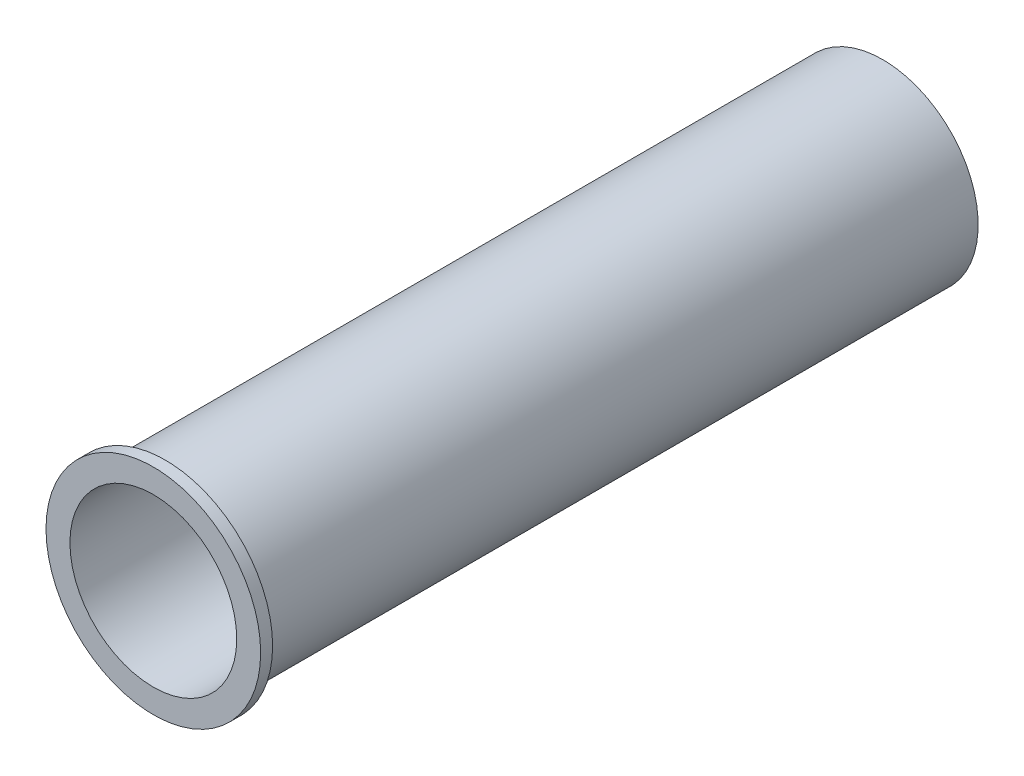
ISO-10303-21;
HEADER;
FILE_DESCRIPTION(('STEP AP214'),'2;1');
FILE_NAME('part.step','',(''),(''),'','','');
FILE_SCHEMA(('AUTOMOTIVE_DESIGN { 1 0 10303 214 1 1 1 1 }'));
ENDSEC;
DATA;
#1=APPLICATION_CONTEXT('core data for automotive mechanical design processes');
#2=APPLICATION_PROTOCOL_DEFINITION('international standard','automotive_design',2000,#1);
#3=PRODUCT_CONTEXT('',#1,'mechanical');
#4=PRODUCT('Part','Part','',(#3));
#5=PRODUCT_RELATED_PRODUCT_CATEGORY('part','',(#4));
#6=PRODUCT_DEFINITION_FORMATION('','',#4);
#7=PRODUCT_DEFINITION_CONTEXT('part definition',#1,'design');
#8=PRODUCT_DEFINITION('design','',#6,#7);
#9=PRODUCT_DEFINITION_SHAPE('','',#8);
#10=(LENGTH_UNIT() NAMED_UNIT(*) SI_UNIT(.MILLI.,.METRE.));
#11=(NAMED_UNIT(*) PLANE_ANGLE_UNIT() SI_UNIT($,.RADIAN.));
#12=(NAMED_UNIT(*) SI_UNIT($,.STERADIAN.) SOLID_ANGLE_UNIT());
#13=UNCERTAINTY_MEASURE_WITH_UNIT(LENGTH_MEASURE(1.E-05),#10,'distance_accuracy_value','');
#14=(GEOMETRIC_REPRESENTATION_CONTEXT(3) GLOBAL_UNCERTAINTY_ASSIGNED_CONTEXT((#13)) GLOBAL_UNIT_ASSIGNED_CONTEXT((#10,
#11,#12)) REPRESENTATION_CONTEXT('',''));
#15=CARTESIAN_POINT('',(0.,0.,0.));
#16=DIRECTION('',(0.,0.,1.));
#17=DIRECTION('',(1.,0.,0.));
#18=AXIS2_PLACEMENT_3D('',#15,#16,#17);
#19=CARTESIAN_POINT('',(0.,0.,0.));
#20=DIRECTION('',(0.,0.,-1.));
#21=DIRECTION('',(-1.,0.,0.));
#22=AXIS2_PLACEMENT_3D('',#19,#20,#21);
#23=CYLINDRICAL_SURFACE('',#22,17.95);
#24=CARTESIAN_POINT('',(0.,0.,60.));
#25=DIRECTION('',(0.,0.,-1.));
#26=DIRECTION('',(-1.,0.,0.));
#27=AXIS2_PLACEMENT_3D('',#24,#25,#26);
#28=CIRCLE('',#27,17.95);
#29=CARTESIAN_POINT('',(-17.95,0.,60.));
#30=VERTEX_POINT('',#29);
#31=EDGE_CURVE('E78',#30,#30,#28,.T.);
#32=ORIENTED_EDGE('',*,*,#31,.T.);
#33=EDGE_LOOP('',(#32));
#34=FACE_BOUND('',#33,.T.);
#35=CARTESIAN_POINT('',(0.,0.,58.));
#36=DIRECTION('',(0.,0.,-1.));
#37=DIRECTION('',(-1.,0.,0.));
#38=AXIS2_PLACEMENT_3D('',#35,#36,#37);
#39=CIRCLE('',#38,17.95);
#40=CARTESIAN_POINT('',(-17.95,0.,58.));
#41=VERTEX_POINT('',#40);
#42=EDGE_CURVE('E10',#41,#41,#39,.T.);
#43=ORIENTED_EDGE('',*,*,#42,.F.);
#44=EDGE_LOOP('',(#43));
#45=FACE_BOUND('',#44,.T.);
#46=ADVANCED_FACE('F43',(#34,#45),#23,.T.);
#47=CARTESIAN_POINT('',(0.,17.95,58.));
#48=DIRECTION('',(0.,0.,-1.));
#49=DIRECTION('',(-1.,0.,0.));
#50=AXIS2_PLACEMENT_3D('',#47,#48,#49);
#51=PLANE('',#50);
#52=ORIENTED_EDGE('',*,*,#42,.T.);
#53=EDGE_LOOP('',(#52));
#54=FACE_BOUND('',#53,.T.);
#55=CARTESIAN_POINT('',(0.,0.,58.));
#56=DIRECTION('',(0.,0.,-1.));
#57=DIRECTION('',(-1.,0.,0.));
#58=AXIS2_PLACEMENT_3D('',#55,#56,#57);
#59=CIRCLE('',#58,15.95);
#60=CARTESIAN_POINT('',(-15.95,0.,58.));
#61=VERTEX_POINT('',#60);
#62=EDGE_CURVE('E50',#61,#61,#59,.T.);
#63=ORIENTED_EDGE('',*,*,#62,.F.);
#64=EDGE_LOOP('',(#63));
#65=FACE_BOUND('',#64,.T.);
#66=ADVANCED_FACE('F97',(#54,#65),#51,.T.);
#67=CARTESIAN_POINT('',(0.,0.,0.));
#68=DIRECTION('',(0.,0.,-1.));
#69=DIRECTION('',(-1.,0.,0.));
#70=AXIS2_PLACEMENT_3D('',#67,#68,#69);
#71=CYLINDRICAL_SURFACE('',#70,15.95);
#72=ORIENTED_EDGE('',*,*,#62,.T.);
#73=EDGE_LOOP('',(#72));
#74=FACE_BOUND('',#73,.T.);
#75=CARTESIAN_POINT('',(0.,0.,-62.));
#76=DIRECTION('',(0.,0.,-1.));
#77=DIRECTION('',(-1.,0.,0.));
#78=AXIS2_PLACEMENT_3D('',#75,#76,#77);
#79=CIRCLE('',#78,15.95);
#80=CARTESIAN_POINT('',(-15.95,0.,-62.));
#81=VERTEX_POINT('',#80);
#82=EDGE_CURVE('E55',#81,#81,#79,.T.);
#83=ORIENTED_EDGE('',*,*,#82,.F.);
#84=EDGE_LOOP('',(#83));
#85=FACE_BOUND('',#84,.T.);
#86=ADVANCED_FACE('F101',(#74,#85),#71,.T.);
#87=CARTESIAN_POINT('',(0.,15.95,-62.));
#88=DIRECTION('',(0.,0.,-1.));
#89=DIRECTION('',(-1.,0.,0.));
#90=AXIS2_PLACEMENT_3D('',#87,#88,#89);
#91=PLANE('',#90);
#92=ORIENTED_EDGE('',*,*,#82,.T.);
#93=EDGE_LOOP('',(#92));
#94=FACE_BOUND('',#93,.T.);
#95=CARTESIAN_POINT('',(0.,0.,-62.));
#96=DIRECTION('',(0.,0.,-1.));
#97=DIRECTION('',(-1.,0.,0.));
#98=AXIS2_PLACEMENT_3D('',#95,#96,#97);
#99=CIRCLE('',#98,12.45);
#100=CARTESIAN_POINT('',(-12.45,0.,-62.));
#101=VERTEX_POINT('',#100);
#102=EDGE_CURVE('E60',#101,#101,#99,.T.);
#103=ORIENTED_EDGE('',*,*,#102,.F.);
#104=EDGE_LOOP('',(#103));
#105=FACE_BOUND('',#104,.T.);
#106=ADVANCED_FACE('F105',(#94,#105),#91,.T.);
#107=CARTESIAN_POINT('',(0.,0.,0.));
#108=DIRECTION('',(0.,0.,-1.));
#109=DIRECTION('',(-1.,0.,0.));
#110=AXIS2_PLACEMENT_3D('',#107,#108,#109);
#111=CYLINDRICAL_SURFACE('',#110,12.45);
#112=ORIENTED_EDGE('',*,*,#102,.T.);
#113=EDGE_LOOP('',(#112));
#114=FACE_BOUND('',#113,.T.);
#115=CARTESIAN_POINT('',(0.,0.,-60.));
#116=DIRECTION('',(0.,0.,-1.));
#117=DIRECTION('',(-1.,0.,0.));
#118=AXIS2_PLACEMENT_3D('',#115,#116,#117);
#119=CIRCLE('',#118,12.45);
#120=CARTESIAN_POINT('',(-12.45,0.,-60.));
#121=VERTEX_POINT('',#120);
#122=EDGE_CURVE('E66',#121,#121,#119,.T.);
#123=ORIENTED_EDGE('',*,*,#122,.F.);
#124=EDGE_LOOP('',(#123));
#125=FACE_BOUND('',#124,.T.);
#126=ADVANCED_FACE('F111',(#114,#125),#111,.F.);
#127=CARTESIAN_POINT('',(0.,12.45,-60.));
#128=DIRECTION('',(0.,0.,1.));
#129=DIRECTION('',(1.,0.,0.));
#130=AXIS2_PLACEMENT_3D('',#127,#128,#129);
#131=PLANE('',#130);
#132=ORIENTED_EDGE('',*,*,#122,.T.);
#133=EDGE_LOOP('',(#132));
#134=FACE_BOUND('',#133,.T.);
#135=CARTESIAN_POINT('',(0.,0.,-60.));
#136=DIRECTION('',(0.,0.,-1.));
#137=DIRECTION('',(-1.,0.,0.));
#138=AXIS2_PLACEMENT_3D('',#135,#136,#137);
#139=CIRCLE('',#138,13.95);
#140=CARTESIAN_POINT('',(-13.95,0.,-60.));
#141=VERTEX_POINT('',#140);
#142=EDGE_CURVE('E70',#141,#141,#139,.T.);
#143=ORIENTED_EDGE('',*,*,#142,.F.);
#144=EDGE_LOOP('',(#143));
#145=FACE_BOUND('',#144,.T.);
#146=ADVANCED_FACE('F93',(#134,#145),#131,.T.);
#147=CARTESIAN_POINT('',(0.,0.,0.));
#148=DIRECTION('',(0.,0.,-1.));
#149=DIRECTION('',(-1.,0.,0.));
#150=AXIS2_PLACEMENT_3D('',#147,#148,#149);
#151=CYLINDRICAL_SURFACE('',#150,13.95);
#152=ORIENTED_EDGE('',*,*,#142,.T.);
#153=EDGE_LOOP('',(#152));
#154=FACE_BOUND('',#153,.T.);
#155=CARTESIAN_POINT('',(0.,0.,60.));
#156=DIRECTION('',(0.,0.,-1.));
#157=DIRECTION('',(-1.,0.,0.));
#158=AXIS2_PLACEMENT_3D('',#155,#156,#157);
#159=CIRCLE('',#158,13.95);
#160=CARTESIAN_POINT('',(-13.95,0.,60.));
#161=VERTEX_POINT('',#160);
#162=EDGE_CURVE('E74',#161,#161,#159,.T.);
#163=ORIENTED_EDGE('',*,*,#162,.F.);
#164=EDGE_LOOP('',(#163));
#165=FACE_BOUND('',#164,.T.);
#166=ADVANCED_FACE('F87',(#154,#165),#151,.F.);
#167=CARTESIAN_POINT('',(0.,13.95,60.));
#168=DIRECTION('',(0.,0.,1.));
#169=DIRECTION('',(1.,0.,0.));
#170=AXIS2_PLACEMENT_3D('',#167,#168,#169);
#171=PLANE('',#170);
#172=ORIENTED_EDGE('',*,*,#162,.T.);
#173=EDGE_LOOP('',(#172));
#174=FACE_BOUND('',#173,.T.);
#175=ORIENTED_EDGE('',*,*,#31,.F.);
#176=EDGE_LOOP('',(#175));
#177=FACE_BOUND('',#176,.T.);
#178=ADVANCED_FACE('F85',(#174,#177),#171,.T.);
#179=CLOSED_SHELL('',(#46,#66,#86,#106,#126,#146,#166,#178));
#180=MANIFOLD_SOLID_BREP('B2',#179);
#181=ADVANCED_BREP_SHAPE_REPRESENTATION('',(#18,#180),#14);
#182=SHAPE_DEFINITION_REPRESENTATION(#9,#181);
ENDSEC;
END-ISO-10303-21;
